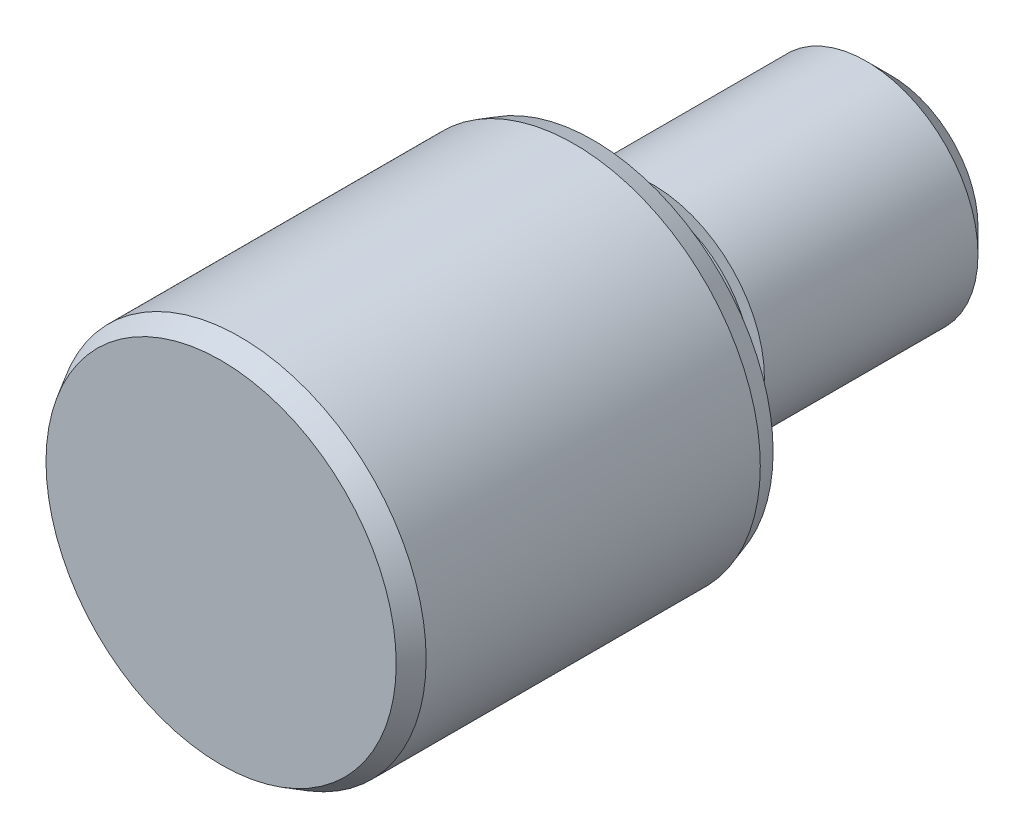
ISO-10303-21;
HEADER;
FILE_DESCRIPTION(('STEP AP214'),'2;1');
FILE_NAME('part.step','',(''),(''),'','','');
FILE_SCHEMA(('AUTOMOTIVE_DESIGN { 1 0 10303 214 1 1 1 1 }'));
ENDSEC;
DATA;
#1=APPLICATION_CONTEXT('core data for automotive mechanical design processes');
#2=APPLICATION_PROTOCOL_DEFINITION('international standard','automotive_design',2000,#1);
#3=PRODUCT_CONTEXT('',#1,'mechanical');
#4=PRODUCT('Part','Part','',(#3));
#5=PRODUCT_RELATED_PRODUCT_CATEGORY('part','',(#4));
#6=PRODUCT_DEFINITION_FORMATION('','',#4);
#7=PRODUCT_DEFINITION_CONTEXT('part definition',#1,'design');
#8=PRODUCT_DEFINITION('design','',#6,#7);
#9=PRODUCT_DEFINITION_SHAPE('','',#8);
#10=(LENGTH_UNIT() NAMED_UNIT(*) SI_UNIT(.MILLI.,.METRE.));
#11=(NAMED_UNIT(*) PLANE_ANGLE_UNIT() SI_UNIT($,.RADIAN.));
#12=(NAMED_UNIT(*) SI_UNIT($,.STERADIAN.) SOLID_ANGLE_UNIT());
#13=UNCERTAINTY_MEASURE_WITH_UNIT(LENGTH_MEASURE(1.E-05),#10,'distance_accuracy_value','');
#14=(GEOMETRIC_REPRESENTATION_CONTEXT(3) GLOBAL_UNCERTAINTY_ASSIGNED_CONTEXT((#13)) GLOBAL_UNIT_ASSIGNED_CONTEXT((#10,
#11,#12)) REPRESENTATION_CONTEXT('',''));
#15=CARTESIAN_POINT('',(0.,0.,0.));
#16=DIRECTION('',(0.,0.,1.));
#17=DIRECTION('',(1.,0.,0.));
#18=AXIS2_PLACEMENT_3D('',#15,#16,#17);
#19=CARTESIAN_POINT('',(0.,0.,-14.2875));
#20=DIRECTION('',(0.,0.,1.));
#21=DIRECTION('',(1.,0.,0.));
#22=AXIS2_PLACEMENT_3D('',#19,#20,#21);
#23=PLANE('',#22);
#24=CARTESIAN_POINT('',(0.,0.,-14.2875));
#25=DIRECTION('',(0.,0.,1.));
#26=DIRECTION('',(1.,0.,0.));
#27=AXIS2_PLACEMENT_3D('',#24,#25,#26);
#28=CIRCLE('',#27,3.71475);
#29=CARTESIAN_POINT('',(3.71475,0.,-14.2875));
#30=VERTEX_POINT('',#29);
#31=EDGE_CURVE('E57',#30,#30,#28,.F.);
#32=ORIENTED_EDGE('',*,*,#31,.T.);
#33=EDGE_LOOP('',(#32));
#34=FACE_BOUND('',#33,.T.);
#35=ADVANCED_FACE('F37',(#34),#23,.F.);
#36=CARTESIAN_POINT('',(0.,0.,14.2875));
#37=DIRECTION('',(0.,0.,1.));
#38=DIRECTION('',(1.,0.,0.));
#39=AXIS2_PLACEMENT_3D('',#36,#37,#38);
#40=CYLINDRICAL_SURFACE('',#39,4.7625);
#41=CARTESIAN_POINT('',(0.,0.,-13.23975));
#42=DIRECTION('',(0.,0.,1.));
#43=DIRECTION('',(1.,0.,0.));
#44=AXIS2_PLACEMENT_3D('',#41,#42,#43);
#45=CIRCLE('',#44,4.7625);
#46=CARTESIAN_POINT('',(4.7625,0.,-13.23975));
#47=VERTEX_POINT('',#46);
#48=EDGE_CURVE('E60',#47,#47,#45,.T.);
#49=ORIENTED_EDGE('',*,*,#48,.T.);
#50=EDGE_LOOP('',(#49));
#51=FACE_BOUND('',#50,.T.);
#52=CARTESIAN_POINT('',(0.,0.,-4.1275));
#53=DIRECTION('',(0.,0.,1.));
#54=DIRECTION('',(1.,0.,0.));
#55=AXIS2_PLACEMENT_3D('',#52,#53,#54);
#56=CIRCLE('',#55,4.7625);
#57=CARTESIAN_POINT('',(4.7625,0.,-4.1275));
#58=VERTEX_POINT('',#57);
#59=EDGE_CURVE('E69',#58,#58,#56,.T.);
#60=ORIENTED_EDGE('',*,*,#59,.F.);
#61=EDGE_LOOP('',(#60));
#62=FACE_BOUND('',#61,.T.);
#63=ADVANCED_FACE('F81',(#51,#62),#40,.T.);
#64=CARTESIAN_POINT('',(0.,4.7625,-4.1275));
#65=DIRECTION('',(0.,0.,-1.));
#66=DIRECTION('',(-1.,0.,0.));
#67=AXIS2_PLACEMENT_3D('',#64,#65,#66);
#68=PLANE('',#67);
#69=CARTESIAN_POINT('',(0.,0.,-4.1275));
#70=DIRECTION('',(0.,0.,1.));
#71=DIRECTION('',(1.,0.,0.));
#72=AXIS2_PLACEMENT_3D('',#69,#70,#71);
#73=CIRCLE('',#72,4.21481250000001);
#74=CARTESIAN_POINT('',(4.21481250000001,0.,-4.1275));
#75=VERTEX_POINT('',#74);
#76=EDGE_CURVE('E72',#75,#75,#73,.T.);
#77=ORIENTED_EDGE('',*,*,#76,.F.);
#78=EDGE_LOOP('',(#77));
#79=FACE_BOUND('',#78,.T.);
#80=ORIENTED_EDGE('',*,*,#59,.T.);
#81=EDGE_LOOP('',(#80));
#82=FACE_BOUND('',#81,.T.);
#83=ADVANCED_FACE('F78',(#79,#82),#68,.F.);
#84=CARTESIAN_POINT('',(0.,0.,14.2875));
#85=DIRECTION('',(0.,0.,1.));
#86=DIRECTION('',(1.,0.,0.));
#87=AXIS2_PLACEMENT_3D('',#84,#85,#86);
#88=CYLINDRICAL_SURFACE('',#87,4.21481250000001);
#89=CARTESIAN_POINT('',(0.,0.,-1.778));
#90=DIRECTION('',(0.,0.,1.));
#91=DIRECTION('',(1.,0.,0.));
#92=AXIS2_PLACEMENT_3D('',#89,#90,#91);
#93=CIRCLE('',#92,4.21481250000001);
#94=CARTESIAN_POINT('',(4.21481250000001,0.,-1.778));
#95=VERTEX_POINT('',#94);
#96=EDGE_CURVE('E48',#95,#95,#93,.F.);
#97=ORIENTED_EDGE('',*,*,#96,.T.);
#98=EDGE_LOOP('',(#97));
#99=FACE_BOUND('',#98,.T.);
#100=ORIENTED_EDGE('',*,*,#76,.T.);
#101=EDGE_LOOP('',(#100));
#102=FACE_BOUND('',#101,.T.);
#103=ADVANCED_FACE('F76',(#99,#102),#88,.T.);
#104=CARTESIAN_POINT('',(0.,4.2148125,-1.5875));
#105=DIRECTION('',(0.,0.,1.));
#106=DIRECTION('',(1.,0.,0.));
#107=AXIS2_PLACEMENT_3D('',#104,#105,#106);
#108=PLANE('',#107);
#109=CARTESIAN_POINT('',(0.,0.,-1.5875));
#110=DIRECTION('',(0.,0.,1.));
#111=DIRECTION('',(1.,0.,0.));
#112=AXIS2_PLACEMENT_3D('',#109,#110,#111);
#113=CIRCLE('',#112,7.67443689093744);
#114=CARTESIAN_POINT('',(7.67443689093744,0.,-1.5875));
#115=VERTEX_POINT('',#114);
#116=EDGE_CURVE('E10',#115,#115,#113,.F.);
#117=ORIENTED_EDGE('',*,*,#116,.T.);
#118=EDGE_LOOP('',(#117));
#119=FACE_BOUND('',#118,.T.);
#120=CARTESIAN_POINT('',(0.,0.,-1.5875));
#121=DIRECTION('',(0.,0.,1.));
#122=DIRECTION('',(1.,0.,0.));
#123=AXIS2_PLACEMENT_3D('',#120,#121,#122);
#124=CIRCLE('',#123,4.4053125);
#125=CARTESIAN_POINT('',(4.4053125,0.,-1.5875));
#126=VERTEX_POINT('',#125);
#127=EDGE_CURVE('E52',#126,#126,#124,.T.);
#128=ORIENTED_EDGE('',*,*,#127,.T.);
#129=EDGE_LOOP('',(#128));
#130=FACE_BOUND('',#129,.T.);
#131=ADVANCED_FACE('F116',(#119,#130),#108,.F.);
#132=CARTESIAN_POINT('',(0.,0.,14.2875));
#133=DIRECTION('',(0.,0.,1.));
#134=DIRECTION('',(1.,0.,0.));
#135=AXIS2_PLACEMENT_3D('',#132,#133,#134);
#136=CYLINDRICAL_SURFACE('',#135,7.9375);
#137=CARTESIAN_POINT('',(0.,0.,-0.777875000000022));
#138=DIRECTION('',(0.,0.,1.));
#139=DIRECTION('',(1.,0.,0.));
#140=AXIS2_PLACEMENT_3D('',#137,#138,#139);
#141=CIRCLE('',#140,7.9375);
#142=CARTESIAN_POINT('',(7.9375,0.,-0.777875000000022));
#143=VERTEX_POINT('',#142);
#144=EDGE_CURVE('E44',#143,#143,#141,.T.);
#145=ORIENTED_EDGE('',*,*,#144,.T.);
#146=EDGE_LOOP('',(#145));
#147=FACE_BOUND('',#146,.T.);
#148=CARTESIAN_POINT('',(0.,0.,13.477875));
#149=DIRECTION('',(0.,0.,-1.));
#150=DIRECTION('',(-1.,0.,0.));
#151=AXIS2_PLACEMENT_3D('',#148,#149,#150);
#152=CIRCLE('',#151,7.9375);
#153=CARTESIAN_POINT('',(-7.9375,0.,13.477875));
#154=VERTEX_POINT('',#153);
#155=EDGE_CURVE('E63',#154,#154,#152,.T.);
#156=ORIENTED_EDGE('',*,*,#155,.T.);
#157=EDGE_LOOP('',(#156));
#158=FACE_BOUND('',#157,.T.);
#159=ADVANCED_FACE('F117',(#147,#158),#136,.T.);
#160=CARTESIAN_POINT('',(0.,7.93749999999999,14.2875));
#161=DIRECTION('',(0.,0.,-1.));
#162=DIRECTION('',(-1.,0.,0.));
#163=AXIS2_PLACEMENT_3D('',#160,#161,#162);
#164=PLANE('',#163);
#165=CARTESIAN_POINT('',(0.,0.,14.2875));
#166=DIRECTION('',(0.,0.,-1.));
#167=DIRECTION('',(-1.,0.,0.));
#168=AXIS2_PLACEMENT_3D('',#165,#166,#167);
#169=CIRCLE('',#168,7.47006278830734);
#170=CARTESIAN_POINT('',(-7.47006278830734,0.,14.2875));
#171=VERTEX_POINT('',#170);
#172=EDGE_CURVE('E66',#171,#171,#169,.F.);
#173=ORIENTED_EDGE('',*,*,#172,.T.);
#174=EDGE_LOOP('',(#173));
#175=FACE_BOUND('',#174,.T.);
#176=ADVANCED_FACE('F99',(#175),#164,.F.);
#177=CARTESIAN_POINT('',(0.,0.,14.2875));
#178=DIRECTION('',(0.,0.,-1.));
#179=DIRECTION('',(-1.,0.,0.));
#180=AXIS2_PLACEMENT_3D('',#177,#178,#179);
#181=CONICAL_SURFACE('',#180,7.47006278830734,0.523598775598296);
#182=ORIENTED_EDGE('',*,*,#155,.F.);
#183=EDGE_LOOP('',(#182));
#184=FACE_BOUND('',#183,.T.);
#185=ORIENTED_EDGE('',*,*,#172,.F.);
#186=EDGE_LOOP('',(#185));
#187=FACE_BOUND('',#186,.T.);
#188=ADVANCED_FACE('F95',(#184,#187),#181,.T.);
#189=CARTESIAN_POINT('',(0.,0.,-13.23975));
#190=DIRECTION('',(0.,0.,1.));
#191=DIRECTION('',(1.,0.,0.));
#192=AXIS2_PLACEMENT_3D('',#189,#190,#191);
#193=CONICAL_SURFACE('',#192,4.7625,0.78539816339745);
#194=ORIENTED_EDGE('',*,*,#31,.F.);
#195=EDGE_LOOP('',(#194));
#196=FACE_BOUND('',#195,.T.);
#197=ORIENTED_EDGE('',*,*,#48,.F.);
#198=EDGE_LOOP('',(#197));
#199=FACE_BOUND('',#198,.T.);
#200=ADVANCED_FACE('F98',(#196,#199),#193,.T.);
#201=CARTESIAN_POINT('',(0.,0.,-1.778));
#202=DIRECTION('',(0.,0.,1.));
#203=DIRECTION('',(1.,0.,0.));
#204=AXIS2_PLACEMENT_3D('',#201,#202,#203);
#205=TOROIDAL_SURFACE('',#204,4.4053125,0.1905);
#206=ORIENTED_EDGE('',*,*,#96,.F.);
#207=EDGE_LOOP('',(#206));
#208=FACE_BOUND('',#207,.T.);
#209=ORIENTED_EDGE('',*,*,#127,.F.);
#210=EDGE_LOOP('',(#209));
#211=FACE_BOUND('',#210,.T.);
#212=ADVANCED_FACE('F102',(#208,#211),#205,.F.);
#213=CARTESIAN_POINT('',(0.,0.,-0.777875000000022));
#214=DIRECTION('',(0.,0.,1.));
#215=DIRECTION('',(1.,0.,0.));
#216=AXIS2_PLACEMENT_3D('',#213,#214,#215);
#217=CONICAL_SURFACE('',#216,7.9375,0.314159265358979);
#218=ORIENTED_EDGE('',*,*,#116,.F.);
#219=EDGE_LOOP('',(#218));
#220=FACE_BOUND('',#219,.T.);
#221=ORIENTED_EDGE('',*,*,#144,.F.);
#222=EDGE_LOOP('',(#221));
#223=FACE_BOUND('',#222,.T.);
#224=ADVANCED_FACE('F39',(#220,#223),#217,.T.);
#225=CLOSED_SHELL('',(#35,#63,#83,#103,#131,#159,#176,#188,#200,#212,#224));
#226=MANIFOLD_SOLID_BREP('B2',#225);
#227=ADVANCED_BREP_SHAPE_REPRESENTATION('',(#18,#226),#14);
#228=SHAPE_DEFINITION_REPRESENTATION(#9,#227);
ENDSEC;
END-ISO-10303-21;
